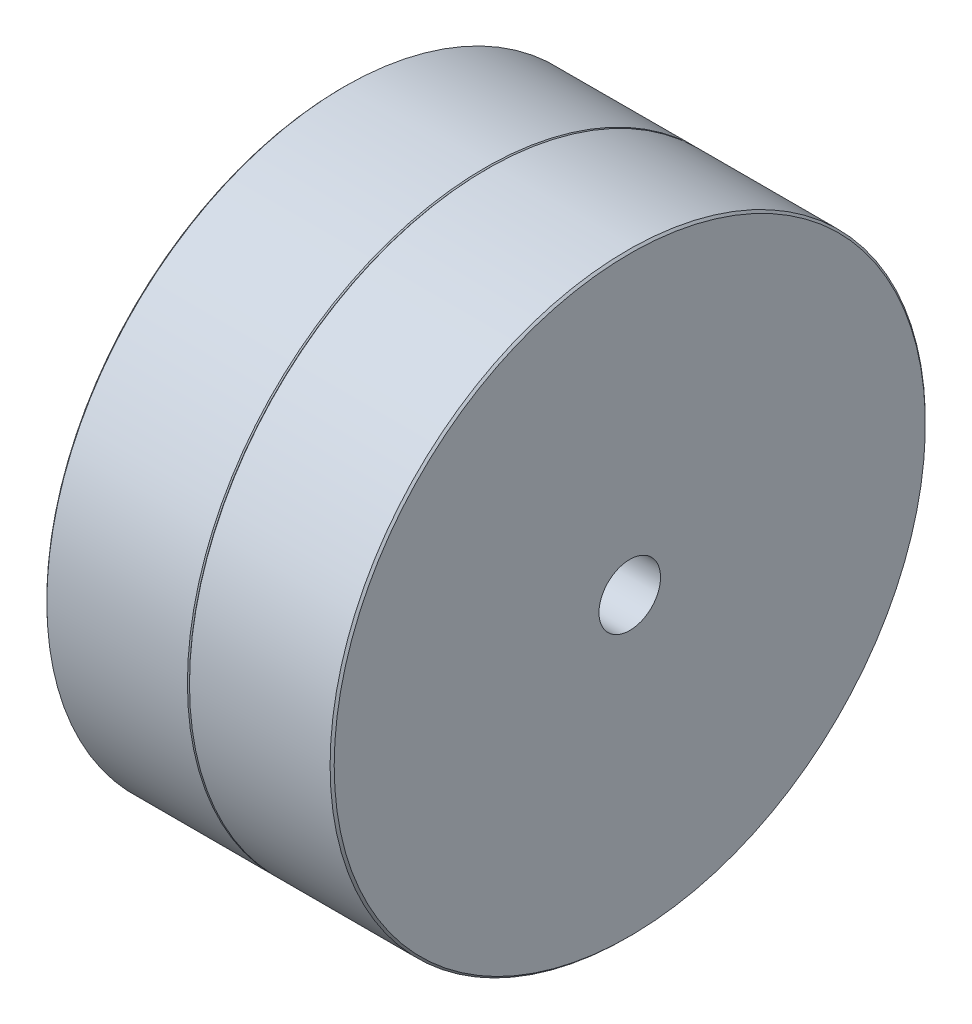
ISO-10303-21;
HEADER;
FILE_DESCRIPTION(('STEP AP214'),'2;1');
FILE_NAME('part.step','',(''),(''),'','','');
FILE_SCHEMA(('AUTOMOTIVE_DESIGN { 1 0 10303 214 1 1 1 1 }'));
ENDSEC;
DATA;
#1=APPLICATION_CONTEXT('core data for automotive mechanical design processes');
#2=APPLICATION_PROTOCOL_DEFINITION('international standard','automotive_design',2000,#1);
#3=PRODUCT_CONTEXT('',#1,'mechanical');
#4=PRODUCT('Part','Part','',(#3));
#5=PRODUCT_RELATED_PRODUCT_CATEGORY('part','',(#4));
#6=PRODUCT_DEFINITION_FORMATION('','',#4);
#7=PRODUCT_DEFINITION_CONTEXT('part definition',#1,'design');
#8=PRODUCT_DEFINITION('design','',#6,#7);
#9=PRODUCT_DEFINITION_SHAPE('','',#8);
#10=(LENGTH_UNIT() NAMED_UNIT(*) SI_UNIT(.MILLI.,.METRE.));
#11=(NAMED_UNIT(*) PLANE_ANGLE_UNIT() SI_UNIT($,.RADIAN.));
#12=(NAMED_UNIT(*) SI_UNIT($,.STERADIAN.) SOLID_ANGLE_UNIT());
#13=UNCERTAINTY_MEASURE_WITH_UNIT(LENGTH_MEASURE(1.E-05),#10,'distance_accuracy_value','');
#14=(GEOMETRIC_REPRESENTATION_CONTEXT(3) GLOBAL_UNCERTAINTY_ASSIGNED_CONTEXT((#13)) GLOBAL_UNIT_ASSIGNED_CONTEXT((#10,
#11,#12)) REPRESENTATION_CONTEXT('',''));
#15=CARTESIAN_POINT('',(0.,0.,0.));
#16=DIRECTION('',(0.,0.,1.));
#17=DIRECTION('',(1.,0.,0.));
#18=AXIS2_PLACEMENT_3D('',#15,#16,#17);
#19=CARTESIAN_POINT('',(0.,0.,0.));
#20=DIRECTION('',(-1.,0.,0.));
#21=DIRECTION('',(0.,0.,1.));
#22=AXIS2_PLACEMENT_3D('',#19,#20,#21);
#23=CYLINDRICAL_SURFACE('',#22,3.);
#24=CARTESIAN_POINT('',(0.199999999999984,0.,0.));
#25=DIRECTION('',(1.,0.,0.));
#26=DIRECTION('',(0.,0.,-1.));
#27=AXIS2_PLACEMENT_3D('',#24,#25,#26);
#28=CIRCLE('',#27,3.);
#29=CARTESIAN_POINT('',(0.199999999999984,0.,3.));
#30=VERTEX_POINT('',#29);
#31=EDGE_CURVE('E10',#30,#30,#28,.F.);
#32=ORIENTED_EDGE('',*,*,#31,.T.);
#33=EDGE_LOOP('',(#32));
#34=FACE_BOUND('',#33,.T.);
#35=CARTESIAN_POINT('',(28.,0.,0.));
#36=DIRECTION('',(-1.,0.,0.));
#37=DIRECTION('',(0.,0.,1.));
#38=AXIS2_PLACEMENT_3D('',#35,#36,#37);
#39=CIRCLE('',#38,3.);
#40=CARTESIAN_POINT('',(28.,0.,3.));
#41=VERTEX_POINT('',#40);
#42=EDGE_CURVE('E67',#41,#41,#39,.T.);
#43=ORIENTED_EDGE('',*,*,#42,.F.);
#44=EDGE_LOOP('',(#43));
#45=FACE_BOUND('',#44,.T.);
#46=ADVANCED_FACE('F32',(#34,#45),#23,.F.);
#47=CARTESIAN_POINT('',(0.,3.,0.));
#48=DIRECTION('',(1.,0.,0.));
#49=DIRECTION('',(0.,0.,-1.));
#50=AXIS2_PLACEMENT_3D('',#47,#48,#49);
#51=PLANE('',#50);
#52=CARTESIAN_POINT('',(0.,0.,0.));
#53=DIRECTION('',(1.,0.,0.));
#54=DIRECTION('',(0.,0.,-1.));
#55=AXIS2_PLACEMENT_3D('',#52,#53,#54);
#56=CIRCLE('',#55,28.8);
#57=CARTESIAN_POINT('',(0.,0.,-28.8));
#58=VERTEX_POINT('',#57);
#59=EDGE_CURVE('E43',#58,#58,#56,.F.);
#60=ORIENTED_EDGE('',*,*,#59,.T.);
#61=EDGE_LOOP('',(#60));
#62=FACE_BOUND('',#61,.T.);
#63=CARTESIAN_POINT('',(0.,0.,0.));
#64=DIRECTION('',(1.,0.,0.));
#65=DIRECTION('',(0.,0.,-1.));
#66=AXIS2_PLACEMENT_3D('',#63,#64,#65);
#67=CIRCLE('',#66,3.19999999999998);
#68=CARTESIAN_POINT('',(0.,0.,3.19999999999998));
#69=VERTEX_POINT('',#68);
#70=EDGE_CURVE('E47',#69,#69,#67,.T.);
#71=ORIENTED_EDGE('',*,*,#70,.T.);
#72=EDGE_LOOP('',(#71));
#73=FACE_BOUND('',#72,.T.);
#74=ADVANCED_FACE('F74',(#62,#73),#51,.F.);
#75=CARTESIAN_POINT('',(0.,0.,0.));
#76=DIRECTION('',(-1.,0.,0.));
#77=DIRECTION('',(0.,0.,1.));
#78=AXIS2_PLACEMENT_3D('',#75,#76,#77);
#79=CYLINDRICAL_SURFACE('',#78,29.);
#80=CARTESIAN_POINT('',(0.199999999999975,0.,0.));
#81=DIRECTION('',(1.,0.,0.));
#82=DIRECTION('',(0.,0.,-1.));
#83=AXIS2_PLACEMENT_3D('',#80,#81,#82);
#84=CIRCLE('',#83,29.);
#85=CARTESIAN_POINT('',(0.199999999999975,0.,-29.));
#86=VERTEX_POINT('',#85);
#87=EDGE_CURVE('E39',#86,#86,#84,.T.);
#88=ORIENTED_EDGE('',*,*,#87,.T.);
#89=EDGE_LOOP('',(#88));
#90=FACE_BOUND('',#89,.T.);
#91=CARTESIAN_POINT('',(13.9,0.,0.));
#92=DIRECTION('',(-1.,0.,0.));
#93=DIRECTION('',(0.,0.,1.));
#94=AXIS2_PLACEMENT_3D('',#91,#92,#93);
#95=CIRCLE('',#94,29.);
#96=CARTESIAN_POINT('',(13.9,0.,29.));
#97=VERTEX_POINT('',#96);
#98=EDGE_CURVE('E58',#97,#97,#95,.T.);
#99=ORIENTED_EDGE('',*,*,#98,.T.);
#100=EDGE_LOOP('',(#99));
#101=FACE_BOUND('',#100,.T.);
#102=ADVANCED_FACE('F79',(#90,#101),#79,.T.);
#103=CARTESIAN_POINT('',(14.,0.,0.));
#104=DIRECTION('',(-1.,0.,0.));
#105=DIRECTION('',(0.,0.,1.));
#106=AXIS2_PLACEMENT_3D('',#103,#104,#105);
#107=CONICAL_SURFACE('',#106,28.9,0.785398163397448);
#108=ORIENTED_EDGE('',*,*,#98,.F.);
#109=EDGE_LOOP('',(#108));
#110=FACE_BOUND('',#109,.T.);
#111=CARTESIAN_POINT('',(14.,0.,0.));
#112=DIRECTION('',(-1.,0.,0.));
#113=DIRECTION('',(0.,0.,1.));
#114=AXIS2_PLACEMENT_3D('',#111,#112,#113);
#115=CIRCLE('',#114,28.9);
#116=CARTESIAN_POINT('',(14.,0.,28.9));
#117=VERTEX_POINT('',#116);
#118=EDGE_CURVE('E61',#117,#117,#115,.T.);
#119=ORIENTED_EDGE('',*,*,#118,.T.);
#120=EDGE_LOOP('',(#119));
#121=FACE_BOUND('',#120,.T.);
#122=ADVANCED_FACE('F144',(#110,#121),#107,.T.);
#123=CARTESIAN_POINT('',(14.1,0.,0.));
#124=DIRECTION('',(1.,0.,0.));
#125=DIRECTION('',(0.,0.,-1.));
#126=AXIS2_PLACEMENT_3D('',#123,#124,#125);
#127=CONICAL_SURFACE('',#126,29.,0.785398163397466);
#128=ORIENTED_EDGE('',*,*,#118,.F.);
#129=EDGE_LOOP('',(#128));
#130=FACE_BOUND('',#129,.T.);
#131=CARTESIAN_POINT('',(14.1,0.,0.));
#132=DIRECTION('',(-1.,0.,0.));
#133=DIRECTION('',(0.,0.,1.));
#134=AXIS2_PLACEMENT_3D('',#131,#132,#133);
#135=CIRCLE('',#134,29.);
#136=CARTESIAN_POINT('',(14.1,0.,29.));
#137=VERTEX_POINT('',#136);
#138=EDGE_CURVE('E64',#137,#137,#135,.T.);
#139=ORIENTED_EDGE('',*,*,#138,.T.);
#140=EDGE_LOOP('',(#139));
#141=FACE_BOUND('',#140,.T.);
#142=ADVANCED_FACE('F131',(#130,#141),#127,.T.);
#143=CARTESIAN_POINT('',(0.,0.,0.));
#144=DIRECTION('',(-1.,0.,0.));
#145=DIRECTION('',(0.,0.,1.));
#146=AXIS2_PLACEMENT_3D('',#143,#144,#145);
#147=CYLINDRICAL_SURFACE('',#146,29.);
#148=CARTESIAN_POINT('',(27.8,0.,0.));
#149=DIRECTION('',(-1.,0.,0.));
#150=DIRECTION('',(0.,0.,1.));
#151=AXIS2_PLACEMENT_3D('',#148,#149,#150);
#152=CIRCLE('',#151,29.);
#153=CARTESIAN_POINT('',(27.8,0.,29.));
#154=VERTEX_POINT('',#153);
#155=EDGE_CURVE('E55',#154,#154,#152,.T.);
#156=ORIENTED_EDGE('',*,*,#155,.T.);
#157=EDGE_LOOP('',(#156));
#158=FACE_BOUND('',#157,.T.);
#159=ORIENTED_EDGE('',*,*,#138,.F.);
#160=EDGE_LOOP('',(#159));
#161=FACE_BOUND('',#160,.T.);
#162=ADVANCED_FACE('F120',(#158,#161),#147,.T.);
#163=CARTESIAN_POINT('',(28.,10.,0.));
#164=DIRECTION('',(-1.,0.,0.));
#165=DIRECTION('',(0.,0.,1.));
#166=AXIS2_PLACEMENT_3D('',#163,#164,#165);
#167=PLANE('',#166);
#168=CARTESIAN_POINT('',(28.,0.,0.));
#169=DIRECTION('',(-1.,0.,0.));
#170=DIRECTION('',(0.,0.,1.));
#171=AXIS2_PLACEMENT_3D('',#168,#169,#170);
#172=CIRCLE('',#171,28.8);
#173=CARTESIAN_POINT('',(28.,0.,28.8));
#174=VERTEX_POINT('',#173);
#175=EDGE_CURVE('E52',#174,#174,#172,.F.);
#176=ORIENTED_EDGE('',*,*,#175,.T.);
#177=EDGE_LOOP('',(#176));
#178=FACE_BOUND('',#177,.T.);
#179=ORIENTED_EDGE('',*,*,#42,.T.);
#180=EDGE_LOOP('',(#179));
#181=FACE_BOUND('',#180,.T.);
#182=ADVANCED_FACE('F71',(#178,#181),#167,.F.);
#183=CARTESIAN_POINT('',(27.8,0.,0.));
#184=DIRECTION('',(-1.,0.,0.));
#185=DIRECTION('',(0.,0.,1.));
#186=AXIS2_PLACEMENT_3D('',#183,#184,#185);
#187=CONICAL_SURFACE('',#186,29.,0.78539816339744);
#188=ORIENTED_EDGE('',*,*,#175,.F.);
#189=EDGE_LOOP('',(#188));
#190=FACE_BOUND('',#189,.T.);
#191=ORIENTED_EDGE('',*,*,#155,.F.);
#192=EDGE_LOOP('',(#191));
#193=FACE_BOUND('',#192,.T.);
#194=ADVANCED_FACE('F84',(#190,#193),#187,.T.);
#195=CARTESIAN_POINT('',(0.,0.,0.));
#196=DIRECTION('',(1.,0.,0.));
#197=DIRECTION('',(0.,0.,-1.));
#198=AXIS2_PLACEMENT_3D('',#195,#196,#197);
#199=CONICAL_SURFACE('',#198,28.8,0.785398163397474);
#200=ORIENTED_EDGE('',*,*,#87,.F.);
#201=EDGE_LOOP('',(#200));
#202=FACE_BOUND('',#201,.T.);
#203=ORIENTED_EDGE('',*,*,#59,.F.);
#204=EDGE_LOOP('',(#203));
#205=FACE_BOUND('',#204,.T.);
#206=ADVANCED_FACE('F86',(#202,#205),#199,.T.);
#207=CARTESIAN_POINT('',(0.199999999999984,0.,0.));
#208=DIRECTION('',(-1.,0.,0.));
#209=DIRECTION('',(0.,0.,1.));
#210=AXIS2_PLACEMENT_3D('',#207,#208,#209);
#211=CONICAL_SURFACE('',#210,3.,0.785398163397442);
#212=CARTESIAN_POINT('',(0.,0.,3.19999999999998));
#213=CARTESIAN_POINT('',(0.0020833333333331,0.,3.19791666666665));
#214=CARTESIAN_POINT('',(0.00416666666666629,0.,3.19583333333331));
#215=CARTESIAN_POINT('',(0.00833333333333266,0.,3.19166666666665));
#216=CARTESIAN_POINT('',(0.0104166666666658,0.,3.18958333333332));
#217=CARTESIAN_POINT('',(0.0145833333333321,0.,3.18541666666665));
#218=CARTESIAN_POINT('',(0.0166666666666653,0.,3.18333333333332));
#219=CARTESIAN_POINT('',(0.0208333333333316,0.,3.17916666666665));
#220=CARTESIAN_POINT('',(0.0229166666666648,0.,3.17708333333332));
#221=CARTESIAN_POINT('',(0.0270833333333311,0.,3.17291666666665));
#222=CARTESIAN_POINT('',(0.0291666666666643,0.,3.17083333333332));
#223=CARTESIAN_POINT('',(0.0333333333333306,0.,3.16666666666665));
#224=CARTESIAN_POINT('',(0.0354166666666638,0.,3.16458333333332));
#225=CARTESIAN_POINT('',(0.0395833333333301,0.,3.16041666666665));
#226=CARTESIAN_POINT('',(0.0416666666666633,0.,3.15833333333332));
#227=CARTESIAN_POINT('',(0.0458333333333296,0.,3.15416666666665));
#228=CARTESIAN_POINT('',(0.0479166666666627,0.,3.15208333333332));
#229=CARTESIAN_POINT('',(0.052083333333329,0.,3.14791666666665));
#230=CARTESIAN_POINT('',(0.0541666666666622,0.,3.14583333333332));
#231=CARTESIAN_POINT('',(0.0583333333333286,0.,3.14166666666665));
#232=CARTESIAN_POINT('',(0.0604166666666617,0.,3.13958333333332));
#233=CARTESIAN_POINT('',(0.0645833333333281,0.,3.13541666666665));
#234=CARTESIAN_POINT('',(0.0666666666666612,0.,3.13333333333332));
#235=CARTESIAN_POINT('',(0.0708333333333276,0.,3.12916666666665));
#236=CARTESIAN_POINT('',(0.0729166666666607,0.,3.12708333333332));
#237=CARTESIAN_POINT('',(0.077083333333327,0.,3.12291666666665));
#238=CARTESIAN_POINT('',(0.0791666666666602,0.,3.12083333333332));
#239=CARTESIAN_POINT('',(0.0833333333333265,0.,3.11666666666666));
#240=CARTESIAN_POINT('',(0.0854166666666597,0.,3.11458333333332));
#241=CARTESIAN_POINT('',(0.089583333333326,0.,3.11041666666666));
#242=CARTESIAN_POINT('',(0.0916666666666591,0.,3.10833333333332));
#243=CARTESIAN_POINT('',(0.0958333333333255,0.,3.10416666666666));
#244=CARTESIAN_POINT('',(0.0979166666666587,0.,3.10208333333332));
#245=CARTESIAN_POINT('',(0.102083333333325,0.,3.09791666666666));
#246=CARTESIAN_POINT('',(0.104166666666658,0.,3.09583333333332));
#247=CARTESIAN_POINT('',(0.108333333333324,0.,3.09166666666666));
#248=CARTESIAN_POINT('',(0.110416666666658,0.,3.08958333333332));
#249=CARTESIAN_POINT('',(0.114583333333324,0.,3.08541666666666));
#250=CARTESIAN_POINT('',(0.116666666666657,0.,3.08333333333333));
#251=CARTESIAN_POINT('',(0.120833333333323,0.,3.07916666666666));
#252=CARTESIAN_POINT('',(0.122916666666657,0.,3.07708333333333));
#253=CARTESIAN_POINT('',(0.127083333333323,0.,3.07291666666666));
#254=CARTESIAN_POINT('',(0.129166666666656,0.,3.07083333333333));
#255=CARTESIAN_POINT('',(0.133333333333322,0.,3.06666666666666));
#256=CARTESIAN_POINT('',(0.135416666666656,0.,3.06458333333333));
#257=CARTESIAN_POINT('',(0.139583333333322,0.,3.06041666666666));
#258=CARTESIAN_POINT('',(0.141666666666655,0.,3.05833333333333));
#259=CARTESIAN_POINT('',(0.145833333333321,0.,3.05416666666666));
#260=CARTESIAN_POINT('',(0.147916666666655,0.,3.05208333333333));
#261=CARTESIAN_POINT('',(0.152083333333321,0.,3.04791666666666));
#262=CARTESIAN_POINT('',(0.154166666666654,0.,3.04583333333333));
#263=CARTESIAN_POINT('',(0.15833333333332,0.,3.04166666666666));
#264=CARTESIAN_POINT('',(0.160416666666653,0.,3.03958333333333));
#265=CARTESIAN_POINT('',(0.16458333333332,0.,3.03541666666666));
#266=CARTESIAN_POINT('',(0.166666666666653,0.,3.03333333333333));
#267=CARTESIAN_POINT('',(0.170833333333319,0.,3.02916666666666));
#268=CARTESIAN_POINT('',(0.172916666666652,0.,3.02708333333333));
#269=CARTESIAN_POINT('',(0.177083333333319,0.,3.02291666666666));
#270=CARTESIAN_POINT('',(0.179166666666652,0.,3.02083333333333));
#271=CARTESIAN_POINT('',(0.183333333333318,0.,3.01666666666667));
#272=CARTESIAN_POINT('',(0.185416666666651,0.,3.01458333333333));
#273=CARTESIAN_POINT('',(0.189583333333318,0.,3.01041666666667));
#274=CARTESIAN_POINT('',(0.191666666666651,0.,3.00833333333333));
#275=CARTESIAN_POINT('',(0.195833333333317,0.,3.00416666666667));
#276=CARTESIAN_POINT('',(0.19791666666665,0.,3.00208333333333));
#277=CARTESIAN_POINT('',(0.199999999999984,0.,3.));
#278=B_SPLINE_CURVE_WITH_KNOTS('',3,(#212,#213,#214,#215,#216,#217,#218,#219,#220,#221,#222,
#223,#224,#225,#226,#227,#228,#229,#230,#231,#232,#233,#234,#235,#236,#237,#238,#239,#240,#241,
#242,#243,#244,#245,#246,#247,#248,#249,#250,#251,#252,#253,#254,#255,#256,#257,#258,#259,#260,
#261,#262,#263,#264,#265,#266,#267,#268,#269,#270,#271,#272,#273,#274,#275,#276,#277),
.UNSPECIFIED.,.F.,.F.,(4,2,2,2,2,2,2,2,2,2,2,2,2,2,2,2,2,2,2,2,2,2,2,2,2,2,2,2,2,2,2,2,4),(0.,
0.008838834764831,0.017677669529662,0.0265165042944933,0.0353553390593243,0.0441941738241553,
0.0530330085889863,0.0618718433538173,0.0707106781186486,0.0795495128834796,0.0883883476483106,
0.0972271824131416,0.106066017177973,0.114904851942804,0.123743686707635,0.132582521472466,
0.141421356237297,0.150260191002128,0.159099025766959,0.16793786053179,0.176776695296621,
0.185615530061452,0.194454364826283,0.203293199591114,0.212132034355945,0.220970869120776,
0.229809703885608,0.238648538650439,0.24748737341527,0.256326208180101,0.265165042944932,
0.274003877709763,0.282842712474594),.UNSPECIFIED.);
#279=EDGE_CURVE('BSEAM34',#69,#30,#278,.T.);
#280=ORIENTED_EDGE('',*,*,#70,.F.);
#281=ORIENTED_EDGE('',*,*,#31,.F.);
#282=ORIENTED_EDGE('',*,*,#279,.T.);
#283=ORIENTED_EDGE('',*,*,#279,.F.);
#284=EDGE_LOOP('',(#280,#282,#281,#283));
#285=FACE_BOUND('',#284,.T.);
#286=ADVANCED_FACE('F34',(#285),#211,.F.);
#287=CLOSED_SHELL('',(#46,#74,#102,#122,#142,#162,#182,#194,#206,#286));
#288=MANIFOLD_SOLID_BREP('B2',#287);
#289=ADVANCED_BREP_SHAPE_REPRESENTATION('',(#18,#288),#14);
#290=SHAPE_DEFINITION_REPRESENTATION(#9,#289);
ENDSEC;
END-ISO-10303-21;
